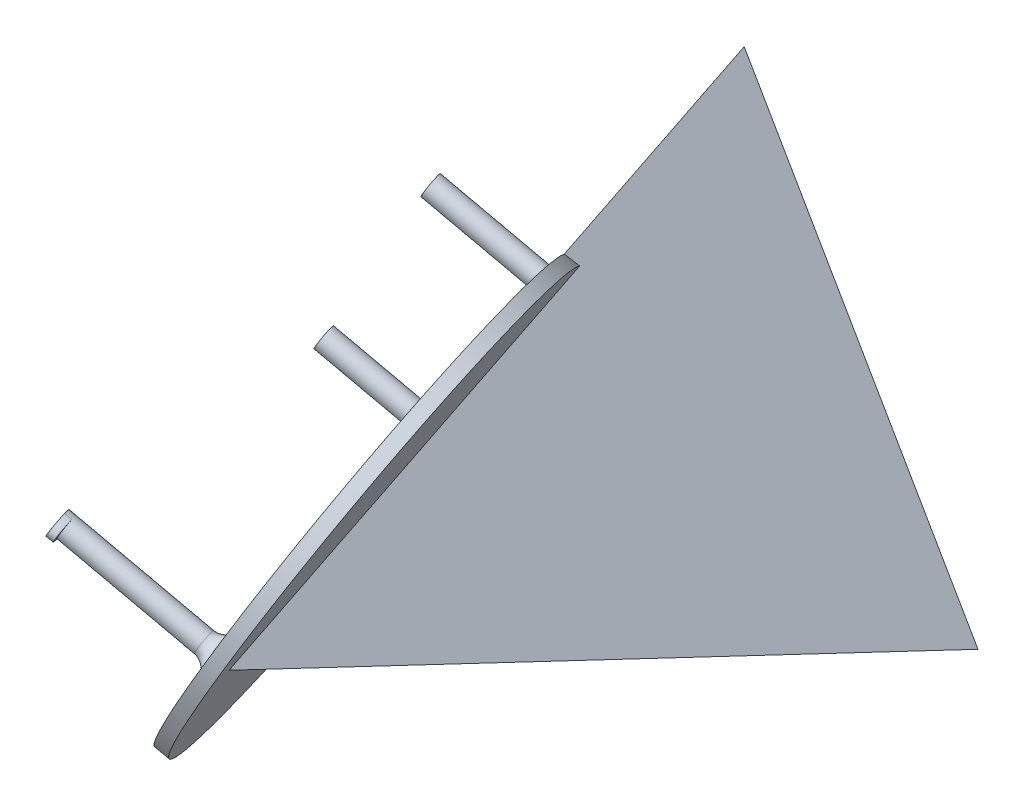
ISO-10303-21;
HEADER;
FILE_DESCRIPTION(('STEP AP214'),'2;1');
FILE_NAME('part.step','',(''),(''),'','','');
FILE_SCHEMA(('AUTOMOTIVE_DESIGN { 1 0 10303 214 1 1 1 1 }'));
ENDSEC;
DATA;
#1=APPLICATION_CONTEXT('core data for automotive mechanical design processes');
#2=APPLICATION_PROTOCOL_DEFINITION('international standard','automotive_design',2000,#1);
#3=PRODUCT_CONTEXT('',#1,'mechanical');
#4=PRODUCT('Part','Part','',(#3));
#5=PRODUCT_RELATED_PRODUCT_CATEGORY('part','',(#4));
#6=PRODUCT_DEFINITION_FORMATION('','',#4);
#7=PRODUCT_DEFINITION_CONTEXT('part definition',#1,'design');
#8=PRODUCT_DEFINITION('design','',#6,#7);
#9=PRODUCT_DEFINITION_SHAPE('','',#8);
#10=(LENGTH_UNIT() NAMED_UNIT(*) SI_UNIT(.MILLI.,.METRE.));
#11=(NAMED_UNIT(*) PLANE_ANGLE_UNIT() SI_UNIT($,.RADIAN.));
#12=(NAMED_UNIT(*) SI_UNIT($,.STERADIAN.) SOLID_ANGLE_UNIT());
#13=UNCERTAINTY_MEASURE_WITH_UNIT(LENGTH_MEASURE(1.E-05),#10,'distance_accuracy_value','');
#14=(GEOMETRIC_REPRESENTATION_CONTEXT(3) GLOBAL_UNCERTAINTY_ASSIGNED_CONTEXT((#13)) GLOBAL_UNIT_ASSIGNED_CONTEXT((#10,
#11,#12)) REPRESENTATION_CONTEXT('',''));
#15=CARTESIAN_POINT('',(0.,0.,0.));
#16=DIRECTION('',(0.,0.,1.));
#17=DIRECTION('',(1.,0.,0.));
#18=AXIS2_PLACEMENT_3D('',#15,#16,#17);
#19=CARTESIAN_POINT('',(0.,0.,0.));
#20=DIRECTION('',(0.,0.,1.));
#21=DIRECTION('',(1.,0.,0.));
#22=AXIS2_PLACEMENT_3D('',#19,#20,#21);
#23=PLANE('',#22);
#24=DIRECTION('',(1.,0.,0.));
#25=VECTOR('',#24,1.);
#26=CARTESIAN_POINT('',(0.,2.06122725869994,0.));
#27=LINE('',#26,#25);
#28=CARTESIAN_POINT('',(-13.9298496619858,2.06122725869994,0.));
#29=VERTEX_POINT('',#28);
#30=CARTESIAN_POINT('',(13.9298496619858,2.06122725869994,0.));
#31=VERTEX_POINT('',#30);
#32=EDGE_CURVE('E150',#29,#31,#27,.T.);
#33=ORIENTED_EDGE('',*,*,#32,.T.);
#34=DIRECTION('',(-0.5,0.866025403784439,0.));
#35=VECTOR('',#34,1.);
#36=CARTESIAN_POINT('',(11.3399248309929,6.54710865376387,0.));
#37=LINE('',#36,#35);
#38=CARTESIAN_POINT('',(0.,26.1884346150555,0.));
#39=VERTEX_POINT('',#38);
#40=EDGE_CURVE('E144',#31,#39,#37,.T.);
#41=ORIENTED_EDGE('',*,*,#40,.T.);
#42=DIRECTION('',(-0.5,-0.866025403784439,0.));
#43=VECTOR('',#42,1.);
#44=CARTESIAN_POINT('',(-11.3399248309929,6.54710865376387,0.));
#45=LINE('',#44,#43);
#46=EDGE_CURVE('E147',#39,#29,#45,.T.);
#47=ORIENTED_EDGE('',*,*,#46,.T.);
#48=EDGE_LOOP('',(#33,#41,#47));
#49=FACE_BOUND('',#48,.T.);
#50=DIRECTION('',(-0.5,0.866025403784439,0.));
#51=VECTOR('',#50,1.);
#52=CARTESIAN_POINT('',(17.5,0.,0.));
#53=LINE('',#52,#51);
#54=CARTESIAN_POINT('',(17.5,0.,0.));
#55=VERTEX_POINT('',#54);
#56=CARTESIAN_POINT('',(0.,30.3108891324554,0.));
#57=VERTEX_POINT('',#56);
#58=EDGE_CURVE('E156',#55,#57,#53,.T.);
#59=ORIENTED_EDGE('',*,*,#58,.F.);
#60=DIRECTION('',(1.,0.,0.));
#61=VECTOR('',#60,1.);
#62=CARTESIAN_POINT('',(-17.5,0.,0.));
#63=LINE('',#62,#61);
#64=CARTESIAN_POINT('',(-17.5,0.,0.));
#65=VERTEX_POINT('',#64);
#66=EDGE_CURVE('E163',#65,#55,#63,.T.);
#67=ORIENTED_EDGE('',*,*,#66,.F.);
#68=DIRECTION('',(-0.5,-0.866025403784439,0.));
#69=VECTOR('',#68,1.);
#70=CARTESIAN_POINT('',(0.,30.3108891324554,0.));
#71=LINE('',#70,#69);
#72=EDGE_CURVE('E159',#57,#65,#71,.T.);
#73=ORIENTED_EDGE('',*,*,#72,.F.);
#74=EDGE_LOOP('',(#59,#67,#73));
#75=FACE_BOUND('',#74,.T.);
#76=ADVANCED_FACE('F33',(#49,#75),#23,.F.);
#77=CARTESIAN_POINT('',(-4.48802462651864,2.59116222625021,40.));
#78=DIRECTION('',(-0.840300748138486,0.485147863137999,0.241921895599665));
#79=DIRECTION('',(0.5,0.866025403784439,0.));
#80=AXIS2_PLACEMENT_3D('',#77,#78,#79);
#81=PLANE('',#80);
#82=CARTESIAN_POINT('',(-9.97931883150656,6.62758781748385,12.8317196642721));
#83=DIRECTION('',(-0.840300748138486,0.485147863137999,0.241921895599665));
#84=DIRECTION('',(-0.5,-0.866025403784439,0.));
#85=AXIS2_PLACEMENT_3D('',#82,#83,#84);
#86=CIRCLE('',#85,0.8);
#87=CARTESIAN_POINT('',(-10.3793188315066,5.9347674944563,12.8317196642721));
#88=VERTEX_POINT('',#87);
#89=EDGE_CURVE('E113',#88,#88,#86,.T.);
#90=ORIENTED_EDGE('',*,*,#89,.F.);
#91=EDGE_LOOP('',(#90));
#92=FACE_BOUND('',#91,.T.);
#93=CARTESIAN_POINT('',(-1.97931883150656,20.4839942780349,12.8317196642721));
#94=DIRECTION('',(-0.840300748138486,0.485147863137999,0.241921895599665));
#95=DIRECTION('',(-0.5,-0.866025403784439,0.));
#96=AXIS2_PLACEMENT_3D('',#93,#94,#95);
#97=CIRCLE('',#96,0.8);
#98=CARTESIAN_POINT('',(-2.37931883150656,19.7911739550073,12.8317196642721));
#99=VERTEX_POINT('',#98);
#100=EDGE_CURVE('E120',#99,#99,#97,.T.);
#101=ORIENTED_EDGE('',*,*,#100,.F.);
#102=EDGE_LOOP('',(#101));
#103=FACE_BOUND('',#102,.T.);
#104=CARTESIAN_POINT('',(-0.322535133839637,10.2898454571639,39.029704273724));
#105=DIRECTION('',(-0.840300748138486,0.485147863137999,0.241921895599665));
#106=DIRECTION('',(-0.5,-0.866025403784439,0.));
#107=AXIS2_PLACEMENT_3D('',#104,#105,#106);
#108=CIRCLE('',#107,1.8);
#109=CARTESIAN_POINT('',(-1.22253513383964,8.73099973035188,39.029704273724));
#110=VERTEX_POINT('',#109);
#111=EDGE_CURVE('E41',#110,#110,#108,.F.);
#112=ORIENTED_EDGE('',*,*,#111,.T.);
#113=EDGE_LOOP('',(#112));
#114=FACE_BOUND('',#113,.T.);
#115=DIRECTION('',(0.386464820204722,0.223125567977517,0.89490777382859));
#116=VECTOR('',#115,1.);
#117=CARTESIAN_POINT('',(-1.4991444048961,9.23809828509757,37.0519884639993));
#118=LINE('',#117,#116);
#119=CARTESIAN_POINT('',(-11.6851623787984,3.35719806589474,13.4649859927936));
#120=VERTEX_POINT('',#119);
#121=EDGE_CURVE('E169',#120,#65,#118,.F.);
#122=ORIENTED_EDGE('',*,*,#121,.F.);
#123=CARTESIAN_POINT('',(-3.2556822363336,11.9832987263615,25.4455641058601));
#124=DIRECTION('',(-0.840300748138486,0.485147863137999,0.241921895599665));
#125=DIRECTION('',(-0.5,-0.866025403784439,0.));
#126=AXIS2_PLACEMENT_3D('',#123,#124,#125);
#127=CIRCLE('',#126,17.);
#128=CARTESIAN_POINT('',(0.,23.5964930006659,13.4649859927936));
#129=VERTEX_POINT('',#128);
#130=EDGE_CURVE('E129',#120,#129,#127,.T.);
#131=ORIENTED_EDGE('',*,*,#130,.T.);
#132=DIRECTION('',(0.,0.446251135955034,-0.89490777382859));
#133=VECTOR('',#132,1.);
#134=CARTESIAN_POINT('',(0.,8.81663617435745,43.1043699724676));
#135=LINE('',#134,#133);
#136=EDGE_CURVE('E160',#57,#129,#135,.F.);
#137=ORIENTED_EDGE('',*,*,#136,.F.);
#138=ORIENTED_EDGE('',*,*,#72,.T.);
#139=EDGE_LOOP('',(#122,#131,#137,#138));
#140=FACE_BOUND('',#139,.T.);
#141=ADVANCED_FACE('F181',(#92,#103,#114,#140),#81,.T.);
#142=CARTESIAN_POINT('',(4.48802462651863,2.5911622262502,40.));
#143=DIRECTION('',(0.840300748138486,0.485147863137999,0.241921895599665));
#144=DIRECTION('',(0.5,-0.866025403784439,0.));
#145=AXIS2_PLACEMENT_3D('',#142,#143,#144);
#146=PLANE('',#145);
#147=CARTESIAN_POINT('',(7.89810230213401,5.54365822059418,22.234398693198));
#148=DIRECTION('',(0.840300748138486,0.485147863137999,0.241921895599665));
#149=DIRECTION('',(-0.542120514902269,0.75199167186311,0.374985163400664));
#150=AXIS2_PLACEMENT_3D('',#147,#148,#149);
#151=ELLIPSE('',#150,41.2410454674731,17.);
#152=CARTESIAN_POINT('',(0.595025056335658,22.8441081596225,12.9070286331434));
#153=VERTEX_POINT('',#152);
#154=EDGE_CURVE('E55',#153,#129,#151,.T.);
#155=ORIENTED_EDGE('',*,*,#154,.F.);
#156=DIRECTION('',(0.,-0.446251135955034,0.89490777382859));
#157=VECTOR('',#156,1.);
#158=CARTESIAN_POINT('',(0.595025056335655,7.99125902183453,42.6927906984058));
#159=LINE('',#158,#157);
#160=CARTESIAN_POINT('',(0.595025056335656,9.76009183436849,39.1455902388438));
#161=VERTEX_POINT('',#160);
#162=EDGE_CURVE('E133',#153,#161,#159,.T.);
#163=ORIENTED_EDGE('',*,*,#162,.T.);
#164=DIRECTION('',(0.386464820204722,-0.223125567977517,-0.89490777382859));
#165=VECTOR('',#164,1.);
#166=CARTESIAN_POINT('',(1.49914440489609,9.23809828509757,37.0519884639993));
#167=LINE('',#166,#165);
#168=EDGE_CURVE('E155',#55,#161,#167,.F.);
#169=ORIENTED_EDGE('',*,*,#168,.F.);
#170=ORIENTED_EDGE('',*,*,#58,.T.);
#171=ORIENTED_EDGE('',*,*,#136,.T.);
#172=EDGE_LOOP('',(#155,#163,#169,#170,#171));
#173=FACE_BOUND('',#172,.T.);
#174=ADVANCED_FACE('F208',(#173),#146,.T.);
#175=CARTESIAN_POINT('',(0.,9.97312011372727,40.));
#176=DIRECTION('',(0.,-0.970295726275997,0.241921895599665));
#177=DIRECTION('',(-1.,0.,0.));
#178=AXIS2_PLACEMENT_3D('',#175,#176,#177);
#179=PLANE('',#178);
#180=CARTESIAN_POINT('',(7.89810230213401,5.54365822059418,22.234398693198));
#181=DIRECTION('',(0.,-0.970295726275997,0.241921895599665));
#182=DIRECTION('',(-0.92230414871892,0.0934943018865103,0.374985163400664));
#183=AXIS2_PLACEMENT_3D('',#180,#181,#182);
#184=ELLIPSE('',#183,41.2410454674731,17.);
#185=CARTESIAN_POINT('',(-10.7360654648646,3.21808367174149,12.9070286331434));
#186=VERTEX_POINT('',#185);
#187=EDGE_CURVE('E173',#120,#186,#184,.T.);
#188=ORIENTED_EDGE('',*,*,#187,.F.);
#189=ORIENTED_EDGE('',*,*,#121,.T.);
#190=ORIENTED_EDGE('',*,*,#66,.T.);
#191=ORIENTED_EDGE('',*,*,#168,.T.);
#192=DIRECTION('',(-0.386464820204722,-0.223125567977517,-0.89490777382859));
#193=VECTOR('',#192,1.);
#194=CARTESIAN_POINT('',(0.820022456048692,9.88999414365977,39.6665999441716));
#195=LINE('',#194,#193);
#196=EDGE_CURVE('E166',#161,#186,#195,.T.);
#197=ORIENTED_EDGE('',*,*,#196,.T.);
#198=EDGE_LOOP('',(#188,#189,#190,#191,#197));
#199=FACE_BOUND('',#198,.T.);
#200=ADVANCED_FACE('F215',(#199),#179,.T.);
#201=CARTESIAN_POINT('',(-2.80742313024167,1.62086649997421,39.5161562088007));
#202=DIRECTION('',(-0.840300748138486,0.485147863137999,0.241921895599665));
#203=DIRECTION('',(0.5,0.866025403784439,0.));
#204=AXIS2_PLACEMENT_3D('',#201,#202,#203);
#205=PLANE('',#204);
#206=DIRECTION('',(-0.386464820204722,-0.223125567977517,-0.89490777382859));
#207=VECTOR('',#206,1.);
#208=CARTESIAN_POINT('',(2.6669026732452,11.6433666871191,38.431862121986));
#209=LINE('',#208,#207);
#210=CARTESIAN_POINT('',(0.,10.1036297108185,32.2563144147792));
#211=VERTEX_POINT('',#210);
#212=EDGE_CURVE('E139',#211,#29,#209,.T.);
#213=ORIENTED_EDGE('',*,*,#212,.T.);
#214=ORIENTED_EDGE('',*,*,#46,.F.);
#215=DIRECTION('',(0.,-0.446251135955034,0.89490777382859));
#216=VECTOR('',#215,1.);
#217=CARTESIAN_POINT('',(0.,5.51512756426576,41.4580528762202));
#218=LINE('',#217,#216);
#219=EDGE_CURVE('E142',#39,#211,#218,.T.);
#220=ORIENTED_EDGE('',*,*,#219,.T.);
#221=EDGE_LOOP('',(#213,#214,#220));
#222=FACE_BOUND('',#221,.T.);
#223=ADVANCED_FACE('F218',(#222),#205,.F.);
#224=CARTESIAN_POINT('',(2.80742313024166,1.62086649997421,39.5161562088007));
#225=DIRECTION('',(0.840300748138486,0.485147863137999,0.241921895599665));
#226=DIRECTION('',(0.5,-0.866025403784439,0.));
#227=AXIS2_PLACEMENT_3D('',#224,#225,#226);
#228=PLANE('',#227);
#229=ORIENTED_EDGE('',*,*,#219,.F.);
#230=ORIENTED_EDGE('',*,*,#40,.F.);
#231=DIRECTION('',(-0.386464820204722,0.223125567977517,0.89490777382859));
#232=VECTOR('',#231,1.);
#233=CARTESIAN_POINT('',(-2.66690267324521,11.6433666871191,38.431862121986));
#234=LINE('',#233,#232);
#235=EDGE_CURVE('E138',#31,#211,#234,.T.);
#236=ORIENTED_EDGE('',*,*,#235,.T.);
#237=EDGE_LOOP('',(#229,#230,#236));
#238=FACE_BOUND('',#237,.T.);
#239=ADVANCED_FACE('F237',(#238),#228,.F.);
#240=CARTESIAN_POINT('',(0.,11.9137115662793,39.5161562088007));
#241=DIRECTION('',(0.,-0.970295726275997,0.241921895599665));
#242=DIRECTION('',(-1.,0.,0.));
#243=AXIS2_PLACEMENT_3D('',#240,#241,#242);
#244=PLANE('',#243);
#245=ORIENTED_EDGE('',*,*,#212,.F.);
#246=ORIENTED_EDGE('',*,*,#235,.F.);
#247=ORIENTED_EDGE('',*,*,#32,.F.);
#248=EDGE_LOOP('',(#245,#246,#247));
#249=FACE_BOUND('',#248,.T.);
#250=ADVANCED_FACE('F213',(#249),#244,.F.);
#251=CARTESIAN_POINT('',(-2.41538148819511,11.4981508632235,25.2036422102604));
#252=DIRECTION('',(-0.840300748138485,0.485147863137999,0.241921895599665));
#253=DIRECTION('',(-0.5,-0.866025403784439,0.));
#254=AXIS2_PLACEMENT_3D('',#251,#252,#253);
#255=CYLINDRICAL_SURFACE('',#254,17.);
#256=CARTESIAN_POINT('',(-2.41538148819511,11.4981508632235,25.2036422102604));
#257=DIRECTION('',(-0.840300748138486,0.485147863137999,0.241921895599665));
#258=DIRECTION('',(-0.5,-0.866025403784439,0.));
#259=AXIS2_PLACEMENT_3D('',#256,#257,#258);
#260=CIRCLE('',#259,17.);
#261=EDGE_CURVE('E130',#186,#153,#260,.T.);
#262=ORIENTED_EDGE('',*,*,#261,.T.);
#263=ORIENTED_EDGE('',*,*,#154,.T.);
#264=ORIENTED_EDGE('',*,*,#130,.F.);
#265=ORIENTED_EDGE('',*,*,#187,.T.);
#266=EDGE_LOOP('',(#262,#263,#264,#265));
#267=FACE_BOUND('',#266,.T.);
#268=ADVANCED_FACE('F199',(#267),#255,.T.);
#269=CARTESIAN_POINT('',(-2.41538148819511,11.4981508632235,25.2036422102604));
#270=DIRECTION('',(-0.840300748138486,0.485147863137999,0.241921895599665));
#271=DIRECTION('',(-0.5,-0.866025403784439,0.));
#272=AXIS2_PLACEMENT_3D('',#269,#270,#271);
#273=PLANE('',#272);
#274=ORIENTED_EDGE('',*,*,#162,.F.);
#275=ORIENTED_EDGE('',*,*,#261,.F.);
#276=ORIENTED_EDGE('',*,*,#196,.F.);
#277=EDGE_LOOP('',(#274,#275,#276));
#278=FACE_BOUND('',#277,.T.);
#279=ADVANCED_FACE('F190',(#278),#273,.F.);
#280=CARTESIAN_POINT('',(-9.56584336336298,15.6264719516819,41.6908451253203));
#281=DIRECTION('',(0.840300748138486,-0.485147863137999,-0.241921895599665));
#282=DIRECTION('',(0.5,0.866025403784439,0.));
#283=AXIS2_PLACEMENT_3D('',#280,#281,#282);
#284=CYLINDRICAL_SURFACE('',#283,0.800000000000004);
#285=DIRECTION('',(-0.840300748138485,0.485147863137999,0.241921895599665));
#286=VECTOR('',#285,1.);
#287=CARTESIAN_POINT('',(-8.74569298929374,16.0767183431404,41.5698841775205));
#288=LINE('',#287,#286);
#289=CARTESIAN_POINT('',(-8.74569298929374,16.0767183431404,41.5698841775205));
#290=VERTEX_POINT('',#289);
#291=CARTESIAN_POINT('',(-9.16584336336298,16.3192922747094,41.6908451253203));
#292=VERTEX_POINT('',#291);
#293=EDGE_CURVE('E105',#290,#292,#288,.T.);
#294=ORIENTED_EDGE('',*,*,#293,.F.);
#295=CARTESIAN_POINT('',(-9.14569298929374,15.3838980201129,41.5698841775205));
#296=DIRECTION('',(-0.840300748138486,0.485147863137999,0.241921895599665));
#297=DIRECTION('',(-0.5,-0.866025403784439,0.));
#298=AXIS2_PLACEMENT_3D('',#295,#296,#297);
#299=CIRCLE('',#298,0.800000000000004);
#300=CARTESIAN_POINT('',(-9.54569298929374,14.6910776970853,41.5698841775205));
#301=VERTEX_POINT('',#300);
#302=EDGE_CURVE('E11',#301,#290,#299,.T.);
#303=ORIENTED_EDGE('',*,*,#302,.F.);
#304=DIRECTION('',(-0.840300748138485,0.485147863137999,0.241921895599665));
#305=VECTOR('',#304,1.);
#306=CARTESIAN_POINT('',(-9.54569298929374,14.6910776970853,41.5698841775205));
#307=LINE('',#306,#305);
#308=CARTESIAN_POINT('',(-9.96584336336298,14.9336516286543,41.6908451253203));
#309=VERTEX_POINT('',#308);
#310=EDGE_CURVE('E107',#301,#309,#307,.T.);
#311=ORIENTED_EDGE('',*,*,#310,.T.);
#312=CARTESIAN_POINT('',(-9.56584336336298,15.6264719516819,41.6908451253203));
#313=DIRECTION('',(-0.840300748138486,0.485147863137999,0.241921895599665));
#314=DIRECTION('',(-0.5,-0.866025403784439,0.));
#315=AXIS2_PLACEMENT_3D('',#312,#313,#314);
#316=CIRCLE('',#315,0.800000000000004);
#317=EDGE_CURVE('E111',#292,#309,#316,.T.);
#318=ORIENTED_EDGE('',*,*,#317,.F.);
#319=EDGE_LOOP('',(#294,#303,#311,#318));
#320=FACE_BOUND('',#319,.T.);
#321=CARTESIAN_POINT('',(-1.16283588197812,10.7749933203019,39.2716261693237));
#322=DIRECTION('',(-0.840300748138486,0.485147863137999,0.241921895599665));
#323=DIRECTION('',(-0.5,-0.866025403784439,0.));
#324=AXIS2_PLACEMENT_3D('',#321,#322,#323);
#325=CIRCLE('',#324,0.800000000000004);
#326=CARTESIAN_POINT('',(-1.56283588197812,10.0821729972743,39.2716261693237));
#327=VERTEX_POINT('',#326);
#328=EDGE_CURVE('E176',#327,#327,#325,.T.);
#329=ORIENTED_EDGE('',*,*,#328,.T.);
#330=EDGE_LOOP('',(#329));
#331=FACE_BOUND('',#330,.T.);
#332=ADVANCED_FACE('F109',(#320,#331),#284,.T.);
#333=CARTESIAN_POINT('',(-9.56584336336298,15.6264719516819,41.6908451253203));
#334=DIRECTION('',(-0.840300748138486,0.485147863137999,0.241921895599665));
#335=DIRECTION('',(-0.5,-0.866025403784439,0.));
#336=AXIS2_PLACEMENT_3D('',#333,#334,#335);
#337=PLANE('',#336);
#338=ORIENTED_EDGE('',*,*,#317,.T.);
#339=CARTESIAN_POINT('',(-9.56584336336298,15.6264719516819,41.6908451253203));
#340=DIRECTION('',(-0.840300748138486,0.485147863137999,0.241921895599665));
#341=DIRECTION('',(0.209510507320997,-0.120960947799833,0.970295726275997));
#342=AXIS2_PLACEMENT_3D('',#339,#340,#341);
#343=ELLIPSE('',#342,1.2,0.800000000000004);
#344=EDGE_CURVE('E47',#309,#292,#343,.T.);
#345=ORIENTED_EDGE('',*,*,#344,.T.);
#346=EDGE_LOOP('',(#338,#345));
#347=FACE_BOUND('',#346,.T.);
#348=ADVANCED_FACE('F187',(#347),#337,.T.);
#349=CARTESIAN_POINT('',(-1.16283588197812,10.7749933203019,39.2716261693237));
#350=DIRECTION('',(-0.840300748138486,0.485147863137999,0.241921895599665));
#351=DIRECTION('',(-0.5,-0.866025403784439,0.));
#352=AXIS2_PLACEMENT_3D('',#349,#350,#351);
#353=TOROIDAL_SURFACE('',#352,1.8,1.);
#354=ORIENTED_EDGE('',*,*,#111,.F.);
#355=EDGE_LOOP('',(#354));
#356=FACE_BOUND('',#355,.T.);
#357=ORIENTED_EDGE('',*,*,#328,.F.);
#358=EDGE_LOOP('',(#357));
#359=FACE_BOUND('',#358,.T.);
#360=ADVANCED_FACE('F35',(#356,#359),#353,.F.);
#361=CARTESIAN_POINT('',(-8.70172481661445,24.3651771831389,14.7670948290694));
#362=DIRECTION('',(0.840300748138485,-0.485147863137999,-0.241921895599665));
#363=DIRECTION('',(0.5,0.866025403784439,0.));
#364=AXIS2_PLACEMENT_3D('',#361,#362,#363);
#365=CYLINDRICAL_SURFACE('',#364,0.8);
#366=CARTESIAN_POINT('',(-8.70172481661445,24.3651771831389,14.7670948290694));
#367=DIRECTION('',(-0.840300748138486,0.485147863137999,0.241921895599665));
#368=DIRECTION('',(-0.5,-0.866025403784439,0.));
#369=AXIS2_PLACEMENT_3D('',#366,#367,#368);
#370=CIRCLE('',#369,0.8);
#371=CARTESIAN_POINT('',(-9.10172481661445,23.6723568601113,14.7670948290694));
#372=VERTEX_POINT('',#371);
#373=EDGE_CURVE('E123',#372,#372,#370,.T.);
#374=ORIENTED_EDGE('',*,*,#373,.F.);
#375=EDGE_LOOP('',(#374));
#376=FACE_BOUND('',#375,.T.);
#377=ORIENTED_EDGE('',*,*,#100,.T.);
#378=EDGE_LOOP('',(#377));
#379=FACE_BOUND('',#378,.T.);
#380=ADVANCED_FACE('F186',(#376,#379),#365,.T.);
#381=CARTESIAN_POINT('',(-8.70172481661445,24.3651771831389,14.7670948290694));
#382=DIRECTION('',(-0.840300748138486,0.485147863137999,0.241921895599665));
#383=DIRECTION('',(-0.5,-0.866025403784439,0.));
#384=AXIS2_PLACEMENT_3D('',#381,#382,#383);
#385=PLANE('',#384);
#386=ORIENTED_EDGE('',*,*,#373,.T.);
#387=EDGE_LOOP('',(#386));
#388=FACE_BOUND('',#387,.T.);
#389=ADVANCED_FACE('F275',(#388),#385,.T.);
#390=CARTESIAN_POINT('',(-16.7017248166144,10.5087707225878,14.7670948290694));
#391=DIRECTION('',(0.840300748138485,-0.485147863137999,-0.241921895599665));
#392=DIRECTION('',(0.5,0.866025403784439,0.));
#393=AXIS2_PLACEMENT_3D('',#390,#391,#392);
#394=CYLINDRICAL_SURFACE('',#393,0.8);
#395=CARTESIAN_POINT('',(-16.7017248166144,10.5087707225878,14.7670948290694));
#396=DIRECTION('',(-0.840300748138486,0.485147863137999,0.241921895599665));
#397=DIRECTION('',(-0.5,-0.866025403784439,0.));
#398=AXIS2_PLACEMENT_3D('',#395,#396,#397);
#399=CIRCLE('',#398,0.8);
#400=CARTESIAN_POINT('',(-17.1017248166144,9.81595039956029,14.7670948290694));
#401=VERTEX_POINT('',#400);
#402=EDGE_CURVE('E117',#401,#401,#399,.T.);
#403=ORIENTED_EDGE('',*,*,#402,.F.);
#404=EDGE_LOOP('',(#403));
#405=FACE_BOUND('',#404,.T.);
#406=ORIENTED_EDGE('',*,*,#89,.T.);
#407=EDGE_LOOP('',(#406));
#408=FACE_BOUND('',#407,.T.);
#409=ADVANCED_FACE('F283',(#405,#408),#394,.T.);
#410=CARTESIAN_POINT('',(-16.7017248166144,10.5087707225878,14.7670948290694));
#411=DIRECTION('',(-0.840300748138486,0.485147863137999,0.241921895599665));
#412=DIRECTION('',(-0.5,-0.866025403784439,0.));
#413=AXIS2_PLACEMENT_3D('',#410,#411,#412);
#414=PLANE('',#413);
#415=ORIENTED_EDGE('',*,*,#402,.T.);
#416=EDGE_LOOP('',(#415));
#417=FACE_BOUND('',#416,.T.);
#418=ADVANCED_FACE('F291',(#417),#414,.T.);
#419=CARTESIAN_POINT('',(-9.14569298929374,15.3838980201129,41.5698841775205));
#420=DIRECTION('',(-0.840300748138486,0.485147863137999,0.241921895599665));
#421=DIRECTION('',(-0.5,-0.866025403784439,0.));
#422=AXIS2_PLACEMENT_3D('',#419,#420,#421);
#423=PLANE('',#422);
#424=CARTESIAN_POINT('',(-9.14569298929374,15.3838980201129,41.5698841775205));
#425=DIRECTION('',(-0.840300748138486,0.485147863137999,0.241921895599665));
#426=DIRECTION('',(0.209510507320997,-0.120960947799833,0.970295726275997));
#427=AXIS2_PLACEMENT_3D('',#424,#425,#426);
#428=ELLIPSE('',#427,1.2,0.800000000000004);
#429=EDGE_CURVE('E99',#301,#290,#428,.T.);
#430=ORIENTED_EDGE('',*,*,#429,.F.);
#431=ORIENTED_EDGE('',*,*,#302,.T.);
#432=EDGE_LOOP('',(#430,#431));
#433=FACE_BOUND('',#432,.T.);
#434=ADVANCED_FACE('F98',(#433),#423,.F.);
#435=DIRECTION('',(-0.840300748138485,0.485147863137999,0.241921895599665));
#436=VECTOR('',#435,1.);
#437=SURFACE_OF_LINEAR_EXTRUSION('',#428,#436);
#438=ORIENTED_EDGE('',*,*,#344,.F.);
#439=ORIENTED_EDGE('',*,*,#310,.F.);
#440=ORIENTED_EDGE('',*,*,#429,.T.);
#441=ORIENTED_EDGE('',*,*,#293,.T.);
#442=EDGE_LOOP('',(#438,#439,#440,#441));
#443=FACE_BOUND('',#442,.T.);
#444=ADVANCED_FACE('F104',(#443),#437,.T.);
#445=CLOSED_SHELL('',(#76,#141,#174,#200,#223,#239,#250,#268,#279,#332,#348,#360,#380,#389,#409,
#418,#434,#444));
#446=MANIFOLD_SOLID_BREP('B2',#445);
#447=ADVANCED_BREP_SHAPE_REPRESENTATION('',(#18,#446),#14);
#448=SHAPE_DEFINITION_REPRESENTATION(#9,#447);
ENDSEC;
END-ISO-10303-21;
